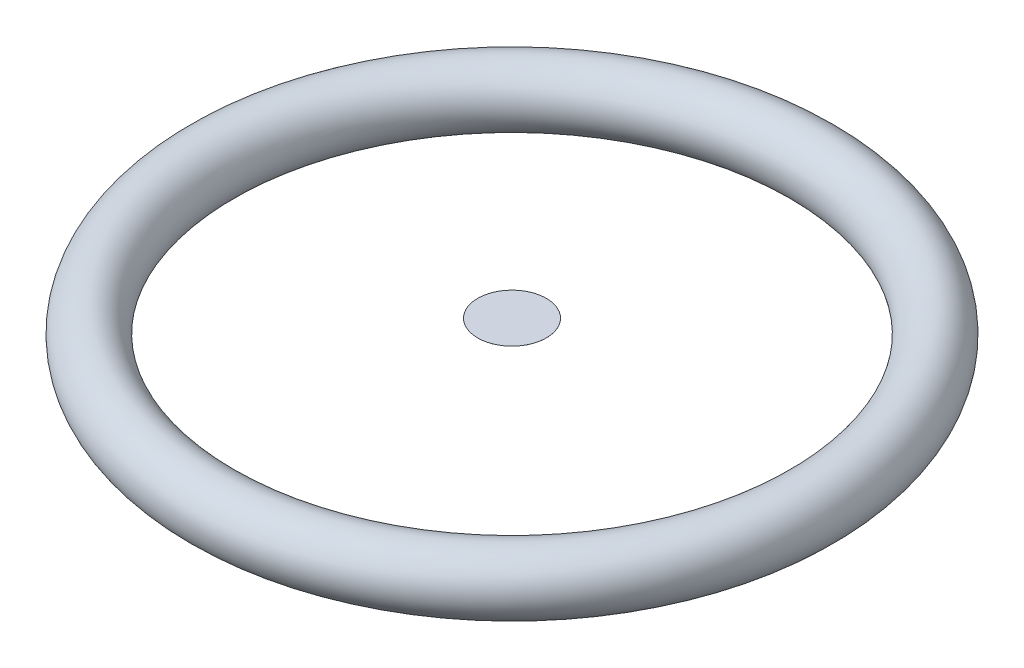
ISO-10303-21;
HEADER;
FILE_DESCRIPTION(('STEP AP214'),'2;1');
FILE_NAME('part.step','',(''),(''),'','','');
FILE_SCHEMA(('AUTOMOTIVE_DESIGN { 1 0 10303 214 1 1 1 1 }'));
ENDSEC;
DATA;
#1=APPLICATION_CONTEXT('core data for automotive mechanical design processes');
#2=APPLICATION_PROTOCOL_DEFINITION('international standard','automotive_design',2000,#1);
#3=PRODUCT_CONTEXT('',#1,'mechanical');
#4=PRODUCT('Part','Part','',(#3));
#5=PRODUCT_RELATED_PRODUCT_CATEGORY('part','',(#4));
#6=PRODUCT_DEFINITION_FORMATION('','',#4);
#7=PRODUCT_DEFINITION_CONTEXT('part definition',#1,'design');
#8=PRODUCT_DEFINITION('design','',#6,#7);
#9=PRODUCT_DEFINITION_SHAPE('','',#8);
#10=(LENGTH_UNIT() NAMED_UNIT(*) SI_UNIT(.MILLI.,.METRE.));
#11=(NAMED_UNIT(*) PLANE_ANGLE_UNIT() SI_UNIT($,.RADIAN.));
#12=(NAMED_UNIT(*) SI_UNIT($,.STERADIAN.) SOLID_ANGLE_UNIT());
#13=UNCERTAINTY_MEASURE_WITH_UNIT(LENGTH_MEASURE(1.E-05),#10,'distance_accuracy_value','');
#14=(GEOMETRIC_REPRESENTATION_CONTEXT(3) GLOBAL_UNCERTAINTY_ASSIGNED_CONTEXT((#13)) GLOBAL_UNIT_ASSIGNED_CONTEXT((#10,
#11,#12)) REPRESENTATION_CONTEXT('',''));
#15=CARTESIAN_POINT('',(0.,0.,0.));
#16=DIRECTION('',(0.,0.,1.));
#17=DIRECTION('',(1.,0.,0.));
#18=AXIS2_PLACEMENT_3D('',#15,#16,#17);
#19=CARTESIAN_POINT('',(0.,0.799,0.));
#20=DIRECTION('',(0.,1.,0.));
#21=DIRECTION('',(0.,0.,1.));
#22=AXIS2_PLACEMENT_3D('',#19,#20,#21);
#23=CYLINDRICAL_SURFACE('',#22,2.);
#24=CARTESIAN_POINT('',(0.,0.799,0.));
#25=DIRECTION('',(0.,1.,0.));
#26=DIRECTION('',(0.,0.,1.));
#27=AXIS2_PLACEMENT_3D('',#24,#25,#26);
#28=CIRCLE('',#27,2.);
#29=CARTESIAN_POINT('',(0.,0.799,2.));
#30=VERTEX_POINT('',#29);
#31=EDGE_CURVE('E11',#30,#30,#28,.T.);
#32=ORIENTED_EDGE('',*,*,#31,.T.);
#33=EDGE_LOOP('',(#32));
#34=FACE_BOUND('',#33,.T.);
#35=CARTESIAN_POINT('',(0.,0.8,0.));
#36=DIRECTION('',(0.,1.,0.));
#37=DIRECTION('',(0.,0.,1.));
#38=AXIS2_PLACEMENT_3D('',#35,#36,#37);
#39=CIRCLE('',#38,2.);
#40=CARTESIAN_POINT('',(0.,0.8,2.));
#41=VERTEX_POINT('',#40);
#42=EDGE_CURVE('E46',#41,#41,#39,.T.);
#43=ORIENTED_EDGE('',*,*,#42,.F.);
#44=EDGE_LOOP('',(#43));
#45=FACE_BOUND('',#44,.T.);
#46=ADVANCED_FACE('F43',(#34,#45),#23,.T.);
#47=CARTESIAN_POINT('',(0.,0.799,0.));
#48=DIRECTION('',(0.,1.,0.));
#49=DIRECTION('',(0.,0.,1.));
#50=AXIS2_PLACEMENT_3D('',#47,#48,#49);
#51=PLANE('',#50);
#52=ORIENTED_EDGE('',*,*,#31,.F.);
#53=EDGE_LOOP('',(#52));
#54=FACE_BOUND('',#53,.T.);
#55=ADVANCED_FACE('F58',(#54),#51,.F.);
#56=CARTESIAN_POINT('',(0.,0.8,0.));
#57=DIRECTION('',(0.,1.,0.));
#58=DIRECTION('',(0.,0.,1.));
#59=AXIS2_PLACEMENT_3D('',#56,#57,#58);
#60=PLANE('',#59);
#61=ORIENTED_EDGE('',*,*,#42,.T.);
#62=EDGE_LOOP('',(#61));
#63=FACE_BOUND('',#62,.T.);
#64=ADVANCED_FACE('F55',(#63),#60,.T.);
#65=CLOSED_SHELL('',(#46,#55,#64));
#66=MANIFOLD_SOLID_BREP('B2',#65);
#67=CARTESIAN_POINT('',(0.,0.,0.));
#68=DIRECTION('',(0.,1.,0.));
#69=DIRECTION('',(0.,0.,1.));
#70=AXIS2_PLACEMENT_3D('',#67,#68,#69);
#71=TOROIDAL_SURFACE('',#70,17.435,1.765);
#72=CARTESIAN_POINT('',(0.,0.,19.2));
#73=VERTEX_POINT('',#72);
#74=VERTEX_LOOP('',#73);
#75=FACE_BOUND('',#74,.T.);
#76=ADVANCED_FACE('F83',(#75),#71,.T.);
#77=CLOSED_SHELL('',(#76));
#78=MANIFOLD_SOLID_BREP('B6',#77);
#79=ADVANCED_BREP_SHAPE_REPRESENTATION('',(#18,#66,#78),#14);
#80=SHAPE_DEFINITION_REPRESENTATION(#9,#79);
ENDSEC;
END-ISO-10303-21;
